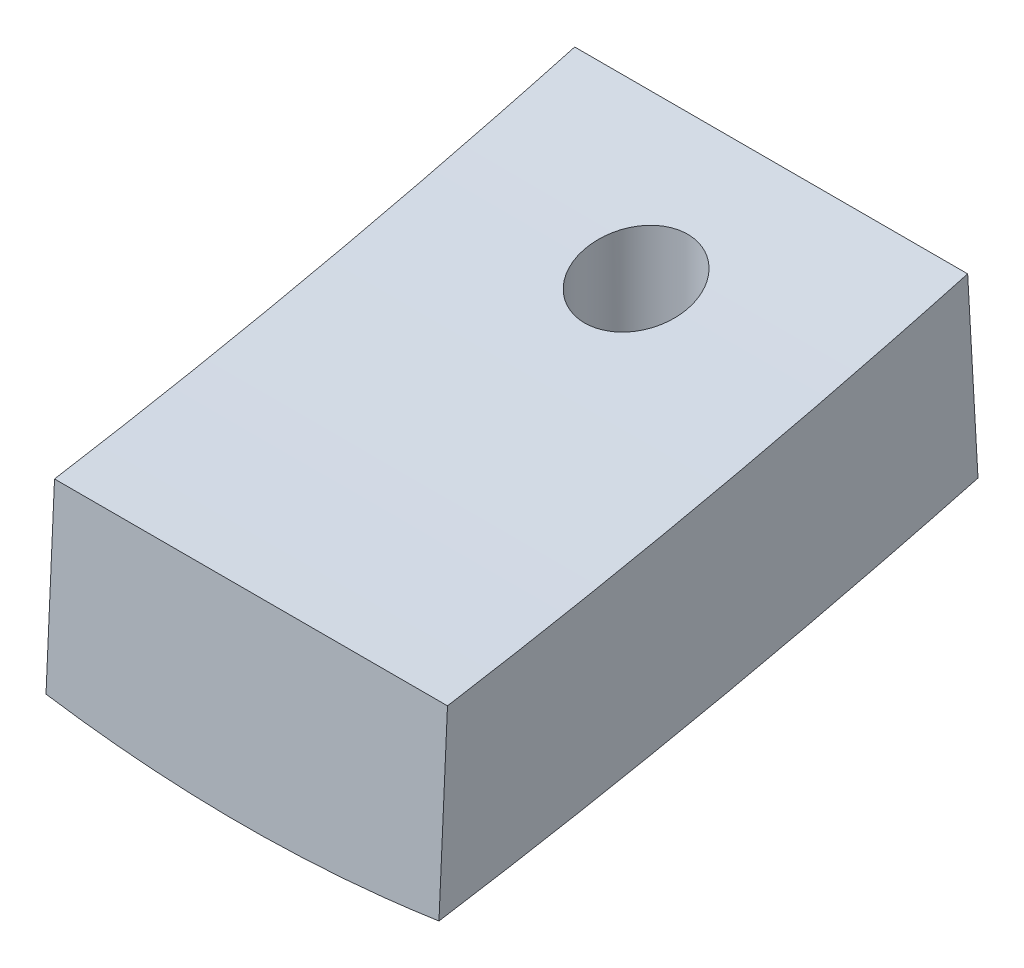
ISO-10303-21;
HEADER;
FILE_DESCRIPTION(('STEP AP214'),'2;1');
FILE_NAME('part.step','',(''),(''),'','','');
FILE_SCHEMA(('AUTOMOTIVE_DESIGN { 1 0 10303 214 1 1 1 1 }'));
ENDSEC;
DATA;
#1=APPLICATION_CONTEXT('core data for automotive mechanical design processes');
#2=APPLICATION_PROTOCOL_DEFINITION('international standard','automotive_design',2000,#1);
#3=PRODUCT_CONTEXT('',#1,'mechanical');
#4=PRODUCT('Part','Part','',(#3));
#5=PRODUCT_RELATED_PRODUCT_CATEGORY('part','',(#4));
#6=PRODUCT_DEFINITION_FORMATION('','',#4);
#7=PRODUCT_DEFINITION_CONTEXT('part definition',#1,'design');
#8=PRODUCT_DEFINITION('design','',#6,#7);
#9=PRODUCT_DEFINITION_SHAPE('','',#8);
#10=(LENGTH_UNIT() NAMED_UNIT(*) SI_UNIT(.MILLI.,.METRE.));
#11=(NAMED_UNIT(*) PLANE_ANGLE_UNIT() SI_UNIT($,.RADIAN.));
#12=(NAMED_UNIT(*) SI_UNIT($,.STERADIAN.) SOLID_ANGLE_UNIT());
#13=UNCERTAINTY_MEASURE_WITH_UNIT(LENGTH_MEASURE(1.E-05),#10,'distance_accuracy_value','');
#14=(GEOMETRIC_REPRESENTATION_CONTEXT(3) GLOBAL_UNCERTAINTY_ASSIGNED_CONTEXT((#13)) GLOBAL_UNIT_ASSIGNED_CONTEXT((#10,
#11,#12)) REPRESENTATION_CONTEXT('',''));
#15=CARTESIAN_POINT('',(0.,0.,0.));
#16=DIRECTION('',(0.,0.,1.));
#17=DIRECTION('',(1.,0.,0.));
#18=AXIS2_PLACEMENT_3D('',#15,#16,#17);
#19=CARTESIAN_POINT('',(-0.000327288565363064,-278.30364049931,10.003258792704));
#20=DIRECTION('',(0.,0.0467739249243161,0.998905501009567));
#21=DIRECTION('',(1.,0.,0.));
#22=AXIS2_PLACEMENT_3D('',#19,#20,#21);
#23=PLANE('',#22);
#24=CARTESIAN_POINT('',(-8.00032899488556,-277.726595487116,9.97623855900722));
#25=CARTESIAN_POINT('',(-0.000325582245166815,-278.880685511504,10.0302790264009));
#26=CARTESIAN_POINT('',(7.99967100511444,-277.726595487116,9.97623855900722));
#27=B_SPLINE_CURVE_WITH_KNOTS('',2,(#24,#25,#26),.UNSPECIFIED.,.F.,.F.,(3,3),(0.,1.),.UNSPECIFIED.);
#28=CARTESIAN_POINT('',(-8.00032899488556,-277.726595487116,9.97623855900722));
#29=VERTEX_POINT('',#28);
#30=CARTESIAN_POINT('',(7.99967100511444,-277.726595487116,9.97623855900722));
#31=VERTEX_POINT('',#30);
#32=EDGE_CURVE('E82',#29,#31,#27,.T.);
#33=ORIENTED_EDGE('',*,*,#32,.T.);
#34=DIRECTION('',(0.,0.998905501009567,-0.0467739249243161));
#35=VECTOR('',#34,1.);
#36=CARTESIAN_POINT('',(7.99967100511444,-277.726595487116,9.97623855900722));
#37=LINE('',#36,#35);
#38=CARTESIAN_POINT('',(7.99967100511444,-270.312396497023,9.62906739358064));
#39=VERTEX_POINT('',#38);
#40=EDGE_CURVE('E77',#31,#39,#37,.T.);
#41=ORIENTED_EDGE('',*,*,#40,.T.);
#42=DIRECTION('',(-1.,0.,0.));
#43=VECTOR('',#42,1.);
#44=CARTESIAN_POINT('',(7.99967100511444,-270.312396497023,9.62906739358064));
#45=LINE('',#44,#43);
#46=CARTESIAN_POINT('',(-8.00032899488556,-270.312396497023,9.62906739358064));
#47=VERTEX_POINT('',#46);
#48=EDGE_CURVE('E94',#39,#47,#45,.T.);
#49=ORIENTED_EDGE('',*,*,#48,.T.);
#50=DIRECTION('',(0.,-0.998905501009567,0.0467739249243161));
#51=VECTOR('',#50,1.);
#52=CARTESIAN_POINT('',(-8.00032899488556,-270.312396497023,9.62906739358064));
#53=LINE('',#52,#51);
#54=EDGE_CURVE('E87',#47,#29,#53,.T.);
#55=ORIENTED_EDGE('',*,*,#54,.T.);
#56=EDGE_LOOP('',(#33,#41,#49,#55));
#57=FACE_BOUND('',#56,.T.);
#58=ADVANCED_FACE('F37',(#57),#23,.T.);
#59=CARTESIAN_POINT('',(-0.000327288565363064,-273.657007253831,-12.0039517415774));
#60=DIRECTION('',(0.,-0.0567199207358707,0.998390129454271));
#61=DIRECTION('',(1.,0.,0.));
#62=AXIS2_PLACEMENT_3D('',#59,#60,#61);
#63=PLANE('',#62);
#64=CARTESIAN_POINT('',(-8.00032899488556,-273.080259960074,-11.9711859320793));
#65=CARTESIAN_POINT('',(-0.000325582245166815,-274.233754547587,-12.0367175510755));
#66=CARTESIAN_POINT('',(7.99967100511444,-273.080259960074,-11.9711859320793));
#67=B_SPLINE_CURVE_WITH_KNOTS('',2,(#64,#65,#66),.UNSPECIFIED.,.F.,.F.,(3,3),(0.,1.),.UNSPECIFIED.);
#68=CARTESIAN_POINT('',(-8.00032899488556,-273.080259960074,-11.9711859320793));
#69=VERTEX_POINT('',#68);
#70=CARTESIAN_POINT('',(7.99967100511444,-273.080259960074,-11.9711859320793));
#71=VERTEX_POINT('',#70);
#72=EDGE_CURVE('E50',#69,#71,#67,.T.);
#73=ORIENTED_EDGE('',*,*,#72,.F.);
#74=DIRECTION('',(0.,-0.998390129454272,-0.056719920735871));
#75=VECTOR('',#74,1.);
#76=CARTESIAN_POINT('',(-8.00032899488556,-265.669886223983,-11.5501923760193));
#77=LINE('',#76,#75);
#78=CARTESIAN_POINT('',(-8.00032899488556,-265.669886223983,-11.5501923760193));
#79=VERTEX_POINT('',#78);
#80=EDGE_CURVE('E65',#79,#69,#77,.T.);
#81=ORIENTED_EDGE('',*,*,#80,.F.);
#82=DIRECTION('',(-1.,0.,0.));
#83=VECTOR('',#82,1.);
#84=CARTESIAN_POINT('',(7.99967100511444,-265.669886223983,-11.5501923760193));
#85=LINE('',#84,#83);
#86=CARTESIAN_POINT('',(7.99967100511444,-265.669886223983,-11.5501923760193));
#87=VERTEX_POINT('',#86);
#88=EDGE_CURVE('E118',#87,#79,#85,.T.);
#89=ORIENTED_EDGE('',*,*,#88,.F.);
#90=DIRECTION('',(0.,0.998390129454272,0.056719920735871));
#91=VECTOR('',#90,1.);
#92=CARTESIAN_POINT('',(7.99967100511444,-273.080259960074,-11.9711859320793));
#93=LINE('',#92,#91);
#94=EDGE_CURVE('E11',#71,#87,#93,.T.);
#95=ORIENTED_EDGE('',*,*,#94,.F.);
#96=EDGE_LOOP('',(#73,#81,#89,#95));
#97=FACE_BOUND('',#96,.T.);
#98=ADVANCED_FACE('F152',(#97),#63,.F.);
#99=CARTESIAN_POINT('',(7.99967100511444,-270.312396497023,9.62906739358064));
#100=CARTESIAN_POINT('',(7.99967100511444,-269.778543552202,6.40294039464994));
#101=CARTESIAN_POINT('',(7.99967100511444,-269.16990494636,3.1932766707723));
#102=CARTESIAN_POINT('',(7.99967100511444,-267.657632970675,-3.87374440474145));
#103=CARTESIAN_POINT('',(7.99967100511444,-266.718782532736,-7.72343462335979));
#104=CARTESIAN_POINT('',(7.99967100511444,-265.669886223983,-11.5501923760193));
#105=CARTESIAN_POINT('',(-8.00032899488556,-270.312396497023,9.62906739358064));
#106=CARTESIAN_POINT('',(-8.00032899488556,-269.778543552202,6.40294039464994));
#107=CARTESIAN_POINT('',(-8.00032899488556,-269.16990494636,3.1932766707723));
#108=CARTESIAN_POINT('',(-8.00032899488556,-267.657632970675,-3.87374440474145));
#109=CARTESIAN_POINT('',(-8.00032899488556,-266.718782532736,-7.72343462335979));
#110=CARTESIAN_POINT('',(-8.00032899488556,-265.669886223983,-11.5501923760193));
#111=B_SPLINE_SURFACE_WITH_KNOTS('',1,3,((#99,#100,#101,#102,#103,#104),(#105,#106,#107,#108,
#109,#110)),.UNSPECIFIED.,.F.,.F.,.F.,(2,2),(4,2,4),(0.,1.),(0.,0.451856112589867,1.),.UNSPECIFIED.);
#112=CARTESIAN_POINT('',(-4.58918944512554E-08,-267.601229164518,-3.95019237601925));
#113=CARTESIAN_POINT('',(-0.115625932972968,-267.601227964708,-3.95019788144253));
#114=CARTESIAN_POINT('',(-0.231337795595131,-267.598983852295,-3.95977832287499));
#115=CARTESIAN_POINT('',(-0.459534774248927,-267.590065184589,-3.99781808341039));
#116=CARTESIAN_POINT('',(-0.572015771745185,-267.583385215292,-4.02630047248832));
#117=CARTESIAN_POINT('',(-0.790367915846305,-267.565794704641,-4.10118723045035));
#118=CARTESIAN_POINT('',(-0.89624566727453,-267.554888471984,-4.14757334620065));
#119=CARTESIAN_POINT('',(-1.09858690786743,-267.52915796891,-4.2567806481067));
#120=CARTESIAN_POINT('',(-1.19505232953879,-267.514334505093,-4.31959845077541));
#121=CARTESIAN_POINT('',(-1.37710423568398,-267.4809893567,-4.46054343192812));
#122=CARTESIAN_POINT('',(-1.46255634041777,-267.462427999253,-4.53883465916651));
#123=CARTESIAN_POINT('',(-1.61914549550459,-267.422216762254,-4.70793582994231));
#124=CARTESIAN_POINT('',(-1.69028045927162,-267.4005664333,-4.79874759498303));
#125=CARTESIAN_POINT('',(-1.81812542060088,-267.354168029744,-4.99272030639138));
#126=CARTESIAN_POINT('',(-1.87442873091244,-267.32935586346,-5.09613392040012));
#127=CARTESIAN_POINT('',(-1.96889347804626,-267.27774166523,-5.31047543181524));
#128=CARTESIAN_POINT('',(-2.00705241630437,-267.250939359819,-5.42140436171396));
#129=CARTESIAN_POINT('',(-2.06511655557869,-267.195339787979,-5.65065680064009));
#130=CARTESIAN_POINT('',(-2.08452998076243,-267.166509031984,-5.76909686764715));
#131=CARTESIAN_POINT('',(-2.10296434107785,-267.108271762313,-6.00741742569258));
#132=CARTESIAN_POINT('',(-2.10198311779695,-267.078865188024,-6.12729806784852));
#133=CARTESIAN_POINT('',(-2.07949768596751,-267.0198262528,-6.36706948223551));
#134=CARTESIAN_POINT('',(-2.05767430865886,-266.990197500666,-6.48693137488654));
#135=CARTESIAN_POINT('',(-1.99356990853556,-266.932040756471,-6.72134373108237));
#136=CARTESIAN_POINT('',(-1.95128837032849,-266.903512792161,-6.83589406073588));
#137=CARTESIAN_POINT('',(-1.84741943129383,-266.848490608547,-7.05608769303301));
#138=CARTESIAN_POINT('',(-1.78587617297341,-266.821991909848,-7.16175066751336));
#139=CARTESIAN_POINT('',(-1.64500862850891,-266.771814063423,-7.36124220587751));
#140=CARTESIAN_POINT('',(-1.5656860636768,-266.748134643089,-7.4550719140313));
#141=CARTESIAN_POINT('',(-1.39320031881733,-266.704869761566,-7.62608427675205));
#142=CARTESIAN_POINT('',(-1.30035877156549,-266.685209494144,-7.70357217149));
#143=CARTESIAN_POINT('',(-1.10221583654637,-266.650082777073,-7.84175607735857));
#144=CARTESIAN_POINT('',(-0.996916728328527,-266.634615561856,-7.90245515383026));
#145=CARTESIAN_POINT('',(-0.780286994106006,-266.608860890885,-8.00339417790078));
#146=CARTESIAN_POINT('',(-0.669236916173036,-266.598430306668,-8.04419982106086));
#147=CARTESIAN_POINT('',(-0.441538276027246,-266.582459084046,-8.10663906333951));
#148=CARTESIAN_POINT('',(-0.324890649521511,-266.576917631337,-8.12827585510705));
#149=CARTESIAN_POINT('',(-0.0924516865389732,-266.571014516402,-8.15132342506002));
#150=CARTESIAN_POINT('',(0.0232877353184942,-266.570526412713,-8.15322793199156));
#151=CARTESIAN_POINT('',(0.253423100275047,-266.574419066645,-8.13803155725336));
#152=CARTESIAN_POINT('',(0.367819132893945,-266.578799497959,-8.12093194931235));
#153=CARTESIAN_POINT('',(0.591173507256942,-266.5922154185,-8.0685032565209));
#154=CARTESIAN_POINT('',(0.700165454688805,-266.601216683969,-8.03330819099838));
#155=CARTESIAN_POINT('',(0.910621551390636,-266.623532314478,-7.94591207257766));
#156=CARTESIAN_POINT('',(1.01208535225914,-266.636846878985,-7.89371023321054));
#157=CARTESIAN_POINT('',(1.20613876283752,-266.667541630101,-7.77311304134845));
#158=CARTESIAN_POINT('',(1.29858951518628,-266.684974455905,-7.70450787267274));
#159=CARTESIAN_POINT('',(1.47069552232577,-266.72322846296,-7.55357538839093));
#160=CARTESIAN_POINT('',(1.55034915430243,-266.744050073273,-7.47124633513999));
#161=CARTESIAN_POINT('',(1.69695121870166,-266.789050070772,-7.29279181196837));
#162=CARTESIAN_POINT('',(1.76349000527555,-266.813305024896,-7.19634919390672));
#163=CARTESIAN_POINT('',(1.87947643201256,-266.863975334599,-6.99420178829464));
#164=CARTESIAN_POINT('',(1.9289214986152,-266.890391014749,-6.88849560906072));
#165=CARTESIAN_POINT('',(2.01075931954041,-266.945410955943,-6.66754204672855));
#166=CARTESIAN_POINT('',(2.04261944358389,-266.974056355038,-6.55210746514593));
#167=CARTESIAN_POINT('',(2.08630779517942,-267.032013399066,-6.31766607026477));
#168=CARTESIAN_POINT('',(2.09813365651369,-267.061325122285,-6.19865883669456));
#169=CARTESIAN_POINT('',(2.10148672383543,-267.120318164612,-5.95822517679708));
#170=CARTESIAN_POINT('',(2.09265434029771,-267.149996951406,-5.83679292321162));
#171=CARTESIAN_POINT('',(2.05411576841504,-267.208371517249,-5.59703582645735));
#172=CARTESIAN_POINT('',(2.02440901633978,-267.23706726973,-5.47871106729862));
#173=CARTESIAN_POINT('',(1.9448459160907,-267.292642708342,-5.24871535702559));
#174=CARTESIAN_POINT('',(1.89500962280107,-267.319524171015,-5.13703790994069));
#175=CARTESIAN_POINT('',(1.77641365513188,-267.370733956738,-4.92357959032444));
#176=CARTESIAN_POINT('',(1.70765628186632,-267.395062589757,-4.82179751638895));
#177=CARTESIAN_POINT('',(1.55445820962846,-267.440035220783,-4.63309795949288));
#178=CARTESIAN_POINT('',(1.47033064232875,-267.460738975225,-4.54594064670454));
#179=CARTESIAN_POINT('',(1.28783565664756,-267.498397980296,-4.38702904579538));
#180=CARTESIAN_POINT('',(1.18946673019664,-267.515352833459,-4.3152763909304));
#181=CARTESIAN_POINT('',(0.984106390357698,-267.544599662824,-4.19128181031064));
#182=CARTESIAN_POINT('',(0.877411387068314,-267.557002981351,-4.13857456288106));
#183=CARTESIAN_POINT('',(0.656379525711116,-267.577379193203,-4.05188880339809));
#184=CARTESIAN_POINT('',(0.542053757873731,-267.585358365808,-4.0178837475006));
#185=CARTESIAN_POINT('',(0.355737451589946,-267.594405719812,-3.97930701695087));
#186=CARTESIAN_POINT('',(0.285066708494297,-267.59696121379,-3.96840455773254));
#187=CARTESIAN_POINT('',(0.142941576120032,-267.600373295861,-3.95384558305286));
#188=CARTESIAN_POINT('',(0.0714871971684674,-267.601229906316,-3.95018897221806));
#189=CARTESIAN_POINT('',(-4.58918944512554E-08,-267.601229164518,-3.95019237601925));
#190=B_SPLINE_CURVE_WITH_KNOTS('',3,(#112,#113,#114,#115,#116,#117,#118,#119,#120,#121,#122,
#123,#124,#125,#126,#127,#128,#129,#130,#131,#132,#133,#134,#135,#136,#137,#138,#139,#140,#141,
#142,#143,#144,#145,#146,#147,#148,#149,#150,#151,#152,#153,#154,#155,#156,#157,#158,#159,#160,
#161,#162,#163,#164,#165,#166,#167,#168,#169,#170,#171,#172,#173,#174,#175,#176,#177,#178,#179,
#180,#181,#182,#183,#184,#185,#186,#187,#188,#189),.UNSPECIFIED.,.T.,.F.,(4,2,2,2,2,2,2,2,2,2,2,
2,2,2,2,2,2,2,2,2,2,2,2,2,2,2,2,2,2,2,2,2,2,2,2,2,2,2,4),(0.,0.346613012478324,
0.693649848796886,1.0403338061454,1.38694643310897,1.73745268202388,2.08800997693242,
2.44736245850046,2.80676441025064,3.17535766635212,3.54398993172451,3.9183593505527,
4.29273820117746,4.66626528545793,5.03975622214591,5.40549097253492,5.77115890208471,
6.1257141528515,6.48021033991358,6.82581446605088,7.17139542986973,7.51445303722926,
7.85752651135169,8.20524813116575,8.55301381111793,8.91034334853766,9.26772666062458,
9.63541180578928,10.0031403746879,10.377317355771,10.7515044422142,11.12531964531,
11.4990894064159,11.8659555437454,12.2328605583216,12.5900735122633,12.9467781602068,
13.1610790875215,13.3753771940826),.UNSPECIFIED.);
#191=CARTESIAN_POINT('',(-4.58918944512554E-08,-267.601229164518,-3.95019237601925));
#192=VERTEX_POINT('',#191);
#193=EDGE_CURVE('E99',#192,#192,#190,.T.);
#194=CARTESIAN_POINT('',(-8.00032899488556,-270.312396497023,9.62906739358064));
#195=CARTESIAN_POINT('',(-8.00032899488556,-269.778543552202,6.40294039464994));
#196=CARTESIAN_POINT('',(-8.00032899488556,-269.16990494636,3.1932766707723));
#197=CARTESIAN_POINT('',(-8.00032899488556,-267.657632970675,-3.87374440474145));
#198=CARTESIAN_POINT('',(-8.00032899488556,-266.718782532736,-7.72343462335979));
#199=CARTESIAN_POINT('',(-8.00032899488556,-265.669886223983,-11.5501923760193));
#200=B_SPLINE_CURVE_WITH_KNOTS('',3,(#194,#195,#196,#197,#198,#199),.UNSPECIFIED.,.F.,.F.,(4,2,
4),(0.,0.451856112589867,1.),.UNSPECIFIED.);
#201=EDGE_CURVE('E97',#47,#79,#200,.T.);
#202=CARTESIAN_POINT('',(7.99967100511444,-270.312396497023,9.62906739358064));
#203=CARTESIAN_POINT('',(7.99967100511444,-269.778543552202,6.40294039464994));
#204=CARTESIAN_POINT('',(7.99967100511444,-269.16990494636,3.1932766707723));
#205=CARTESIAN_POINT('',(7.99967100511444,-267.657632970675,-3.87374440474145));
#206=CARTESIAN_POINT('',(7.99967100511444,-266.718782532736,-7.72343462335979));
#207=CARTESIAN_POINT('',(7.99967100511444,-265.669886223983,-11.5501923760193));
#208=B_SPLINE_CURVE_WITH_KNOTS('',3,(#202,#203,#204,#205,#206,#207),.UNSPECIFIED.,.F.,.F.,(4,2,
4),(0.,0.451856112589867,1.),.UNSPECIFIED.);
#209=EDGE_CURVE('E96',#39,#87,#208,.T.);
#210=ORIENTED_EDGE('',*,*,#193,.T.);
#211=EDGE_LOOP('',(#210));
#212=FACE_BOUND('',#211,.T.);
#213=ORIENTED_EDGE('',*,*,#201,.F.);
#214=ORIENTED_EDGE('',*,*,#48,.F.);
#215=ORIENTED_EDGE('',*,*,#209,.T.);
#216=ORIENTED_EDGE('',*,*,#88,.T.);
#217=EDGE_LOOP('',(#213,#214,#215,#216));
#218=FACE_BOUND('',#217,.T.);
#219=ADVANCED_FACE('F95',(#212,#218),#111,.F.);
#220=CARTESIAN_POINT('',(-8.00032899488556,-270.312396497023,9.62906739358064));
#221=DIRECTION('',(-1.,0.,0.));
#222=DIRECTION('',(0.,0.,1.));
#223=AXIS2_PLACEMENT_3D('',#220,#221,#222);
#224=PLANE('',#223);
#225=CARTESIAN_POINT('',(-8.00032899488556,-277.726595487116,9.97623855900722));
#226=CARTESIAN_POINT('',(-8.00032899488556,-277.198150344449,6.63465027650757));
#227=CARTESIAN_POINT('',(-8.00032899488556,-276.59222766117,3.30913422954849));
#228=CARTESIAN_POINT('',(-8.00032899488556,-275.079955685485,-4.01429050090784));
#229=CARTESIAN_POINT('',(-8.00032899488556,-274.137105361942,-8.00453473391799));
#230=CARTESIAN_POINT('',(-8.00032899488556,-273.080259960074,-11.9711859320793));
#231=B_SPLINE_CURVE_WITH_KNOTS('',3,(#225,#226,#227,#228,#229,#230),.UNSPECIFIED.,.F.,.F.,(4,2,
4),(0.,0.451856112589867,1.),.UNSPECIFIED.);
#232=EDGE_CURVE('E105',#29,#69,#231,.T.);
#233=ORIENTED_EDGE('',*,*,#232,.F.);
#234=ORIENTED_EDGE('',*,*,#54,.F.);
#235=ORIENTED_EDGE('',*,*,#201,.T.);
#236=ORIENTED_EDGE('',*,*,#80,.T.);
#237=EDGE_LOOP('',(#233,#234,#235,#236));
#238=FACE_BOUND('',#237,.T.);
#239=ADVANCED_FACE('F144',(#238),#224,.T.);
#240=CARTESIAN_POINT('',(-8.00032899488556,-277.726595487116,9.97623855900722));
#241=CARTESIAN_POINT('',(-8.00032899488556,-277.198150344449,6.63465027650757));
#242=CARTESIAN_POINT('',(-8.00032899488556,-276.59222766117,3.30913422954849));
#243=CARTESIAN_POINT('',(-8.00032899488556,-275.079955685485,-4.01429050090784));
#244=CARTESIAN_POINT('',(-8.00032899488556,-274.137105361942,-8.00453473391799));
#245=CARTESIAN_POINT('',(-8.00032899488556,-273.080259960074,-11.9711859320793));
#246=CARTESIAN_POINT('',(-0.000325582245166815,-278.880685511504,10.0302790264009));
#247=CARTESIAN_POINT('',(-0.000325582245166815,-278.353082136249,6.67071810644402));
#248=CARTESIAN_POINT('',(-0.000325582245166815,-277.747582219957,3.32716855166639));
#249=CARTESIAN_POINT('',(-0.000325582245166815,-276.235310244271,-4.03616782680226));
#250=CARTESIAN_POINT('',(-0.000325582245166815,-275.291837290819,-8.04829061826132));
#251=CARTESIAN_POINT('',(-0.000325582245166815,-274.233754547587,-12.0367175510755));
#252=CARTESIAN_POINT('',(7.99967100511444,-277.726595487116,9.97623855900722));
#253=CARTESIAN_POINT('',(7.99967100511444,-277.198150344449,6.63465027650757));
#254=CARTESIAN_POINT('',(7.99967100511444,-276.59222766117,3.30913422954849));
#255=CARTESIAN_POINT('',(7.99967100511444,-275.079955685485,-4.01429050090784));
#256=CARTESIAN_POINT('',(7.99967100511444,-274.137105361942,-8.00453473391799));
#257=CARTESIAN_POINT('',(7.99967100511444,-273.080259960074,-11.9711859320793));
#258=B_SPLINE_SURFACE_WITH_KNOTS('',2,3,((#240,#241,#242,#243,#244,#245),(#246,#247,#248,#249,
#250,#251),(#252,#253,#254,#255,#256,#257)),.UNSPECIFIED.,.F.,.F.,.F.,(3,3),(4,2,4),(0.,1.),(0.,
0.451856112589867,1.),.UNSPECIFIED.);
#259=CARTESIAN_POINT('',(-4.58918940175746E-08,-275.63467938684,-3.95019237601925));
#260=CARTESIAN_POINT('',(0.115157036853459,-275.634677009357,-3.95019795866996));
#261=CARTESIAN_POINT('',(0.230399672998591,-275.632170598833,-3.959701876024));
#262=CARTESIAN_POINT('',(0.457654434274383,-275.622243914837,-3.99742552478262));
#263=CARTESIAN_POINT('',(0.56966244082536,-275.614817642038,-4.02566810636104));
#264=CARTESIAN_POINT('',(0.787064055673587,-275.595371157467,-4.09988419685311));
#265=CARTESIAN_POINT('',(0.892465567889503,-275.58335656213,-4.14583602900817));
#266=CARTESIAN_POINT('',(1.09393156167492,-275.555215515383,-4.25397767552947));
#267=CARTESIAN_POINT('',(1.18999770370928,-275.539089797068,-4.31616459491014));
#268=CARTESIAN_POINT('',(1.37175754249589,-275.503055702676,-4.45594544514761));
#269=CARTESIAN_POINT('',(1.45727127335109,-275.483093528743,-4.53375930635375));
#270=CARTESIAN_POINT('',(1.61409665861925,-275.440262767339,-4.70189186913407));
#271=CARTESIAN_POINT('',(1.6854058450652,-275.417393675935,-4.79221273912406));
#272=CARTESIAN_POINT('',(1.81410288646394,-275.368765762535,-4.98579172329818));
#273=CARTESIAN_POINT('',(1.87099597853655,-275.342939765917,-5.08936195294025));
#274=CARTESIAN_POINT('',(1.96656928554886,-275.289832838843,-5.3042445062666));
#275=CARTESIAN_POINT('',(2.00524683774089,-275.262551696321,-5.41555795912742));
#276=CARTESIAN_POINT('',(2.06420420106676,-275.206655029205,-5.6458002887902));
#277=CARTESIAN_POINT('',(2.08399622645475,-275.178023202013,-5.76485034640225));
#278=CARTESIAN_POINT('',(2.10294779573872,-275.12093318697,-6.00462809452381));
#279=CARTESIAN_POINT('',(2.1021059003376,-275.09247501137,-6.12535590147587));
#280=CARTESIAN_POINT('',(2.07964355774723,-275.036288073454,-6.36614484890431));
#281=CARTESIAN_POINT('',(2.05784551624927,-275.008567627941,-6.48619146397835));
#282=CARTESIAN_POINT('',(1.99367543625962,-274.954870255573,-6.7210705295805));
#283=CARTESIAN_POINT('',(1.95130403071179,-274.928893275109,-6.83590314039971));
#284=CARTESIAN_POINT('',(1.84753190552315,-274.879615190559,-7.05580690183363));
#285=CARTESIAN_POINT('',(1.78632348250502,-274.856290168114,-7.16096334327592));
#286=CARTESIAN_POINT('',(1.6463190910364,-274.812616069407,-7.35953800374072));
#287=CARTESIAN_POINT('',(1.56752509664359,-274.792266659544,-7.4529575384444));
#288=CARTESIAN_POINT('',(1.39637371255801,-274.755449154841,-7.62321451227038));
#289=CARTESIAN_POINT('',(1.3043427870522,-274.738907297209,-7.70036411723451));
#290=CARTESIAN_POINT('',(1.10808058693061,-274.709548335443,-7.83807430268528));
#291=CARTESIAN_POINT('',(1.00385092280897,-274.696730740403,-7.89863706947066));
#292=CARTESIAN_POINT('',(0.788701220936164,-274.675362870146,-8.00000567678701));
#293=CARTESIAN_POINT('',(0.677986373830845,-274.666722457221,-8.04122821219871));
#294=CARTESIAN_POINT('',(0.450992449921024,-274.653473352897,-8.10457451689123));
#295=CARTESIAN_POINT('',(0.334713934816507,-274.648864255403,-8.12670020988605));
#296=CARTESIAN_POINT('',(0.101846390831131,-274.643817680911,-8.15093463468997));
#297=CARTESIAN_POINT('',(-0.0147093248346978,-274.643316072978,-8.15335108783968));
#298=CARTESIAN_POINT('',(-0.246562831669918,-274.646326361768,-8.13889922839794));
#299=CARTESIAN_POINT('',(-0.361860676858081,-274.649838085448,-8.12203174726502));
#300=CARTESIAN_POINT('',(-0.587418857166538,-274.660776432944,-8.06966926993592));
#301=CARTESIAN_POINT('',(-0.697698815728702,-274.668186066031,-8.03425512040461));
#302=CARTESIAN_POINT('',(-0.910685929208472,-274.686753004999,-7.94596194857092));
#303=CARTESIAN_POINT('',(-1.01339293078795,-274.697910386739,-7.89308257274931));
#304=CARTESIAN_POINT('',(-1.20921874651304,-274.723836083647,-7.77100791084745));
#305=CARTESIAN_POINT('',(-1.30225665832216,-274.738631844052,-7.70168876367769));
#306=CARTESIAN_POINT('',(-1.47537248521105,-274.771465134599,-7.54905737261319));
#307=CARTESIAN_POINT('',(-1.55544940009242,-274.789502914701,-7.4657440497998));
#308=CARTESIAN_POINT('',(-1.7019293629609,-274.82876922679,-7.28595893183666));
#309=CARTESIAN_POINT('',(-1.768063127666,-274.850048918759,-7.18927899418536));
#310=CARTESIAN_POINT('',(-1.88320641042224,-274.895059189458,-6.98673371862005));
#311=CARTESIAN_POINT('',(-1.93221399387636,-274.918790044683,-6.88086734467861));
#312=CARTESIAN_POINT('',(-2.01289396259446,-274.968704772046,-6.66039591694781));
#313=CARTESIAN_POINT('',(-2.04414496232487,-274.994932283409,-6.54564652168147));
#314=CARTESIAN_POINT('',(-2.08687337105648,-275.048696650919,-6.31282021052936));
#315=CARTESIAN_POINT('',(-2.09834838694041,-275.076233665116,-6.19474289368443));
#316=CARTESIAN_POINT('',(-2.10134878587772,-275.132441635503,-5.95613724340087));
#317=CARTESIAN_POINT('',(-2.09247607197661,-275.16112424501,-5.8356065182791));
#318=CARTESIAN_POINT('',(-2.05422381506296,-275.218274171343,-5.59778437445964));
#319=CARTESIAN_POINT('',(-2.02484276781172,-275.246741472221,-5.4804931940311));
#320=CARTESIAN_POINT('',(-1.94603506058299,-275.302791538255,-5.25163328232826));
#321=CARTESIAN_POINT('',(-1.89646799434566,-275.330366616816,-5.14011092886253));
#322=CARTESIAN_POINT('',(-1.77853288059109,-275.383501436736,-4.92695898178416));
#323=CARTESIAN_POINT('',(-1.71016617309496,-275.40906132157,-4.82532868377372));
#324=CARTESIAN_POINT('',(-1.55733578569521,-275.456953867423,-4.63622418196881));
#325=CARTESIAN_POINT('',(-1.47307706673978,-275.479321861783,-4.54859345184649));
#326=CARTESIAN_POINT('',(-1.29015814798218,-275.520339239835,-4.38879720379035));
#327=CARTESIAN_POINT('',(-1.19149650584829,-275.538988250659,-4.3166332365113));
#328=CARTESIAN_POINT('',(-0.985496067665069,-275.571332144275,-4.19199504662047));
#329=CARTESIAN_POINT('',(-0.878471343281617,-275.58514939527,-4.13903299762316));
#330=CARTESIAN_POINT('',(-0.656640324440561,-275.607927447515,-4.05194866082362));
#331=CARTESIAN_POINT('',(-0.541845789313086,-275.616895410909,-4.01779858731312));
#332=CARTESIAN_POINT('',(-0.355147716812934,-275.627040038073,-3.97921029189302));
#333=CARTESIAN_POINT('',(-0.28459896873212,-275.629900074403,-3.96834464092696));
#334=CARTESIAN_POINT('',(-0.142711107689078,-275.633720469086,-3.9538340155415));
#335=CARTESIAN_POINT('',(-0.0713720084431393,-275.634680860355,-3.95018891600856));
#336=CARTESIAN_POINT('',(-4.58918940175746E-08,-275.63467938684,-3.95019237601925));
#337=B_SPLINE_CURVE_WITH_KNOTS('',3,(#259,#260,#261,#262,#263,#264,#265,#266,#267,#268,#269,
#270,#271,#272,#273,#274,#275,#276,#277,#278,#279,#280,#281,#282,#283,#284,#285,#286,#287,#288,
#289,#290,#291,#292,#293,#294,#295,#296,#297,#298,#299,#300,#301,#302,#303,#304,#305,#306,#307,
#308,#309,#310,#311,#312,#313,#314,#315,#316,#317,#318,#319,#320,#321,#322,#323,#324,#325,#326,
#327,#328,#329,#330,#331,#332,#333,#334,#335,#336),.UNSPECIFIED.,.T.,.F.,(4,2,2,2,2,2,2,2,2,2,2,
2,2,2,2,2,2,2,2,2,2,2,2,2,2,2,2,2,2,2,2,2,2,2,2,2,2,2,4),(0.,0.345205720805827,
0.690833165569511,1.03603888677356,1.38118309406112,1.73157633904397,2.08203041006424,
2.44324667290929,2.80451572197165,3.17488166427588,3.54527344113432,3.91883205404899,
4.29237917508272,4.66223281251044,5.03204495310503,5.39394042748351,5.75578817770801,
6.10943432163208,6.46304483697169,6.81112363545849,7.15918742652172,7.50574645082108,
7.85231249036254,8.20157758779167,8.55086962512445,8.90638998475038,9.26195049147389,
9.62562989365483,9.98935330205887,10.3602533973546,10.7311807001715,11.1047333385164,
11.4782593572721,11.8472619656074,12.2163015518341,12.5751706554776,12.9335082703895,
13.1474632969917,13.3614146162719),.UNSPECIFIED.);
#338=CARTESIAN_POINT('',(-4.58918940175746E-08,-275.63467938684,-3.95019237601925));
#339=VERTEX_POINT('',#338);
#340=EDGE_CURVE('E40',#339,#339,#337,.T.);
#341=CARTESIAN_POINT('',(7.99967100511444,-277.726595487116,9.97623855900722));
#342=CARTESIAN_POINT('',(7.99967100511444,-277.198150344449,6.63465027650757));
#343=CARTESIAN_POINT('',(7.99967100511444,-276.59222766117,3.30913422954849));
#344=CARTESIAN_POINT('',(7.99967100511444,-275.079955685485,-4.01429050090784));
#345=CARTESIAN_POINT('',(7.99967100511444,-274.137105361942,-8.00453473391799));
#346=CARTESIAN_POINT('',(7.99967100511444,-273.080259960074,-11.9711859320793));
#347=B_SPLINE_CURVE_WITH_KNOTS('',3,(#341,#342,#343,#344,#345,#346),.UNSPECIFIED.,.F.,.F.,(4,2,
4),(0.,0.451856112589867,1.),.UNSPECIFIED.);
#348=EDGE_CURVE('E128',#31,#71,#347,.T.);
#349=ORIENTED_EDGE('',*,*,#340,.T.);
#350=EDGE_LOOP('',(#349));
#351=FACE_BOUND('',#350,.T.);
#352=ORIENTED_EDGE('',*,*,#348,.F.);
#353=ORIENTED_EDGE('',*,*,#32,.F.);
#354=ORIENTED_EDGE('',*,*,#232,.T.);
#355=ORIENTED_EDGE('',*,*,#72,.T.);
#356=EDGE_LOOP('',(#352,#353,#354,#355));
#357=FACE_BOUND('',#356,.T.);
#358=ADVANCED_FACE('F143',(#351,#357),#258,.F.);
#359=CARTESIAN_POINT('',(7.99967100511444,-277.726595487116,9.97623855900722));
#360=DIRECTION('',(-1.,0.,0.));
#361=DIRECTION('',(0.,0.,1.));
#362=AXIS2_PLACEMENT_3D('',#359,#360,#361);
#363=PLANE('',#362);
#364=ORIENTED_EDGE('',*,*,#94,.T.);
#365=ORIENTED_EDGE('',*,*,#209,.F.);
#366=ORIENTED_EDGE('',*,*,#40,.F.);
#367=ORIENTED_EDGE('',*,*,#348,.T.);
#368=EDGE_LOOP('',(#364,#365,#366,#367));
#369=FACE_BOUND('',#368,.T.);
#370=ADVANCED_FACE('F102',(#369),#363,.F.);
#371=CARTESIAN_POINT('',(-4.58918944512555E-08,-278.880685511504,-6.05019237601925));
#372=DIRECTION('',(0.,1.,0.));
#373=DIRECTION('',(0.,0.,1.));
#374=AXIS2_PLACEMENT_3D('',#371,#372,#373);
#375=CYLINDRICAL_SURFACE('',#374,2.1);
#376=ORIENTED_EDGE('',*,*,#340,.F.);
#377=EDGE_LOOP('',(#376));
#378=FACE_BOUND('',#377,.T.);
#379=ORIENTED_EDGE('',*,*,#193,.F.);
#380=EDGE_LOOP('',(#379));
#381=FACE_BOUND('',#380,.T.);
#382=ADVANCED_FACE('F156',(#378,#381),#375,.F.);
#383=CLOSED_SHELL('',(#58,#98,#219,#239,#358,#370,#382));
#384=MANIFOLD_SOLID_BREP('B2',#383);
#385=ADVANCED_BREP_SHAPE_REPRESENTATION('',(#18,#384),#14);
#386=SHAPE_DEFINITION_REPRESENTATION(#9,#385);
ENDSEC;
END-ISO-10303-21;
